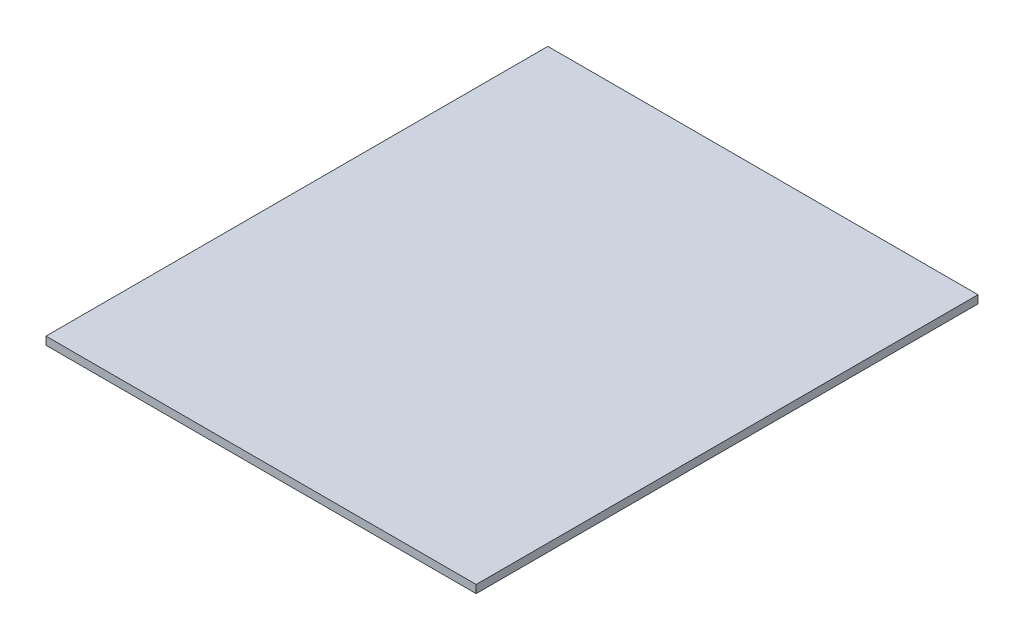
ISO-10303-21;
HEADER;
FILE_DESCRIPTION(('STEP AP214'),'2;1');
FILE_NAME('part.step','',(''),(''),'','','');
FILE_SCHEMA(('AUTOMOTIVE_DESIGN { 1 0 10303 214 1 1 1 1 }'));
ENDSEC;
DATA;
#1=APPLICATION_CONTEXT('core data for automotive mechanical design processes');
#2=APPLICATION_PROTOCOL_DEFINITION('international standard','automotive_design',2000,#1);
#3=PRODUCT_CONTEXT('',#1,'mechanical');
#4=PRODUCT('Part','Part','',(#3));
#5=PRODUCT_RELATED_PRODUCT_CATEGORY('part','',(#4));
#6=PRODUCT_DEFINITION_FORMATION('','',#4);
#7=PRODUCT_DEFINITION_CONTEXT('part definition',#1,'design');
#8=PRODUCT_DEFINITION('design','',#6,#7);
#9=PRODUCT_DEFINITION_SHAPE('','',#8);
#10=(LENGTH_UNIT() NAMED_UNIT(*) SI_UNIT(.MILLI.,.METRE.));
#11=(NAMED_UNIT(*) PLANE_ANGLE_UNIT() SI_UNIT($,.RADIAN.));
#12=(NAMED_UNIT(*) SI_UNIT($,.STERADIAN.) SOLID_ANGLE_UNIT());
#13=UNCERTAINTY_MEASURE_WITH_UNIT(LENGTH_MEASURE(1.E-05),#10,'distance_accuracy_value','');
#14=(GEOMETRIC_REPRESENTATION_CONTEXT(3) GLOBAL_UNCERTAINTY_ASSIGNED_CONTEXT((#13)) GLOBAL_UNIT_ASSIGNED_CONTEXT((#10,
#11,#12)) REPRESENTATION_CONTEXT('',''));
#15=CARTESIAN_POINT('',(0.,0.,0.));
#16=DIRECTION('',(0.,0.,1.));
#17=DIRECTION('',(1.,0.,0.));
#18=AXIS2_PLACEMENT_3D('',#15,#16,#17);
#19=CARTESIAN_POINT('',(270.,10.,315.));
#20=DIRECTION('',(-1.,0.,0.));
#21=DIRECTION('',(0.,0.,1.));
#22=AXIS2_PLACEMENT_3D('',#19,#20,#21);
#23=PLANE('',#22);
#24=DIRECTION('',(0.,0.,-1.));
#25=VECTOR('',#24,1.);
#26=CARTESIAN_POINT('',(270.,0.,315.));
#27=LINE('',#26,#25);
#28=CARTESIAN_POINT('',(270.,0.,315.));
#29=VERTEX_POINT('',#28);
#30=CARTESIAN_POINT('',(270.,0.,-315.));
#31=VERTEX_POINT('',#30);
#32=EDGE_CURVE('E111',#29,#31,#27,.T.);
#33=ORIENTED_EDGE('',*,*,#32,.T.);
#34=DIRECTION('',(0.,-1.,0.));
#35=VECTOR('',#34,1.);
#36=CARTESIAN_POINT('',(270.,10.,-315.));
#37=LINE('',#36,#35);
#38=CARTESIAN_POINT('',(270.,10.,-315.));
#39=VERTEX_POINT('',#38);
#40=EDGE_CURVE('E11',#39,#31,#37,.T.);
#41=ORIENTED_EDGE('',*,*,#40,.F.);
#42=DIRECTION('',(0.,0.,-1.));
#43=VECTOR('',#42,1.);
#44=CARTESIAN_POINT('',(270.,10.,315.));
#45=LINE('',#44,#43);
#46=CARTESIAN_POINT('',(270.,10.,315.));
#47=VERTEX_POINT('',#46);
#48=EDGE_CURVE('E95',#47,#39,#45,.T.);
#49=ORIENTED_EDGE('',*,*,#48,.F.);
#50=DIRECTION('',(0.,-1.,0.));
#51=VECTOR('',#50,1.);
#52=CARTESIAN_POINT('',(270.,10.,315.));
#53=LINE('',#52,#51);
#54=EDGE_CURVE('E107',#47,#29,#53,.T.);
#55=ORIENTED_EDGE('',*,*,#54,.T.);
#56=EDGE_LOOP('',(#33,#41,#49,#55));
#57=FACE_BOUND('',#56,.T.);
#58=ADVANCED_FACE('F43',(#57),#23,.F.);
#59=CARTESIAN_POINT('',(-270.,10.,-315.));
#60=DIRECTION('',(0.,0.,1.));
#61=DIRECTION('',(1.,0.,0.));
#62=AXIS2_PLACEMENT_3D('',#59,#60,#61);
#63=PLANE('',#62);
#64=DIRECTION('',(-1.,0.,0.));
#65=VECTOR('',#64,1.);
#66=CARTESIAN_POINT('',(-270.,0.,-315.));
#67=LINE('',#66,#65);
#68=CARTESIAN_POINT('',(-270.,0.,-315.));
#69=VERTEX_POINT('',#68);
#70=EDGE_CURVE('E100',#31,#69,#67,.T.);
#71=ORIENTED_EDGE('',*,*,#70,.T.);
#72=DIRECTION('',(0.,-1.,0.));
#73=VECTOR('',#72,1.);
#74=CARTESIAN_POINT('',(-270.,10.,-315.));
#75=LINE('',#74,#73);
#76=CARTESIAN_POINT('',(-270.,10.,-315.));
#77=VERTEX_POINT('',#76);
#78=EDGE_CURVE('E52',#77,#69,#75,.T.);
#79=ORIENTED_EDGE('',*,*,#78,.F.);
#80=DIRECTION('',(-1.,0.,0.));
#81=VECTOR('',#80,1.);
#82=CARTESIAN_POINT('',(-270.,10.,-315.));
#83=LINE('',#82,#81);
#84=EDGE_CURVE('E90',#39,#77,#83,.T.);
#85=ORIENTED_EDGE('',*,*,#84,.F.);
#86=ORIENTED_EDGE('',*,*,#40,.T.);
#87=EDGE_LOOP('',(#71,#79,#85,#86));
#88=FACE_BOUND('',#87,.T.);
#89=ADVANCED_FACE('F99',(#88),#63,.F.);
#90=CARTESIAN_POINT('',(-270.,10.,315.));
#91=DIRECTION('',(1.,0.,0.));
#92=DIRECTION('',(0.,0.,-1.));
#93=AXIS2_PLACEMENT_3D('',#90,#91,#92);
#94=PLANE('',#93);
#95=DIRECTION('',(0.,0.,1.));
#96=VECTOR('',#95,1.);
#97=CARTESIAN_POINT('',(-270.,0.,315.));
#98=LINE('',#97,#96);
#99=CARTESIAN_POINT('',(-270.,0.,315.));
#100=VERTEX_POINT('',#99);
#101=EDGE_CURVE('E77',#69,#100,#98,.T.);
#102=ORIENTED_EDGE('',*,*,#101,.T.);
#103=DIRECTION('',(0.,-1.,0.));
#104=VECTOR('',#103,1.);
#105=CARTESIAN_POINT('',(-270.,10.,315.));
#106=LINE('',#105,#104);
#107=CARTESIAN_POINT('',(-270.,10.,315.));
#108=VERTEX_POINT('',#107);
#109=EDGE_CURVE('E102',#108,#100,#106,.T.);
#110=ORIENTED_EDGE('',*,*,#109,.F.);
#111=DIRECTION('',(0.,0.,1.));
#112=VECTOR('',#111,1.);
#113=CARTESIAN_POINT('',(-270.,10.,315.));
#114=LINE('',#113,#112);
#115=EDGE_CURVE('E93',#77,#108,#114,.T.);
#116=ORIENTED_EDGE('',*,*,#115,.F.);
#117=ORIENTED_EDGE('',*,*,#78,.T.);
#118=EDGE_LOOP('',(#102,#110,#116,#117));
#119=FACE_BOUND('',#118,.T.);
#120=ADVANCED_FACE('F103',(#119),#94,.F.);
#121=CARTESIAN_POINT('',(-270.,10.,315.));
#122=DIRECTION('',(0.,0.,-1.));
#123=DIRECTION('',(-1.,0.,0.));
#124=AXIS2_PLACEMENT_3D('',#121,#122,#123);
#125=PLANE('',#124);
#126=DIRECTION('',(1.,0.,0.));
#127=VECTOR('',#126,1.);
#128=CARTESIAN_POINT('',(-270.,0.,315.));
#129=LINE('',#128,#127);
#130=EDGE_CURVE('E83',#100,#29,#129,.T.);
#131=ORIENTED_EDGE('',*,*,#130,.T.);
#132=ORIENTED_EDGE('',*,*,#54,.F.);
#133=DIRECTION('',(1.,0.,0.));
#134=VECTOR('',#133,1.);
#135=CARTESIAN_POINT('',(-270.,10.,315.));
#136=LINE('',#135,#134);
#137=EDGE_CURVE('E60',#108,#47,#136,.T.);
#138=ORIENTED_EDGE('',*,*,#137,.F.);
#139=ORIENTED_EDGE('',*,*,#109,.T.);
#140=EDGE_LOOP('',(#131,#132,#138,#139));
#141=FACE_BOUND('',#140,.T.);
#142=ADVANCED_FACE('F124',(#141),#125,.F.);
#143=CARTESIAN_POINT('',(0.,10.,0.));
#144=DIRECTION('',(0.,-1.,0.));
#145=DIRECTION('',(0.,0.,-1.));
#146=AXIS2_PLACEMENT_3D('',#143,#144,#145);
#147=PLANE('',#146);
#148=ORIENTED_EDGE('',*,*,#48,.T.);
#149=ORIENTED_EDGE('',*,*,#84,.T.);
#150=ORIENTED_EDGE('',*,*,#115,.T.);
#151=ORIENTED_EDGE('',*,*,#137,.T.);
#152=EDGE_LOOP('',(#148,#149,#150,#151));
#153=FACE_BOUND('',#152,.T.);
#154=ADVANCED_FACE('F91',(#153),#147,.F.);
#155=CARTESIAN_POINT('',(0.,0.,0.));
#156=DIRECTION('',(0.,-1.,0.));
#157=DIRECTION('',(0.,0.,-1.));
#158=AXIS2_PLACEMENT_3D('',#155,#156,#157);
#159=PLANE('',#158);
#160=ORIENTED_EDGE('',*,*,#32,.F.);
#161=ORIENTED_EDGE('',*,*,#130,.F.);
#162=ORIENTED_EDGE('',*,*,#101,.F.);
#163=ORIENTED_EDGE('',*,*,#70,.F.);
#164=EDGE_LOOP('',(#160,#161,#162,#163));
#165=FACE_BOUND('',#164,.T.);
#166=ADVANCED_FACE('F127',(#165),#159,.T.);
#167=CLOSED_SHELL('',(#58,#89,#120,#142,#154,#166));
#168=MANIFOLD_SOLID_BREP('B2',#167);
#169=ADVANCED_BREP_SHAPE_REPRESENTATION('',(#18,#168),#14);
#170=SHAPE_DEFINITION_REPRESENTATION(#9,#169);
ENDSEC;
END-ISO-10303-21;
